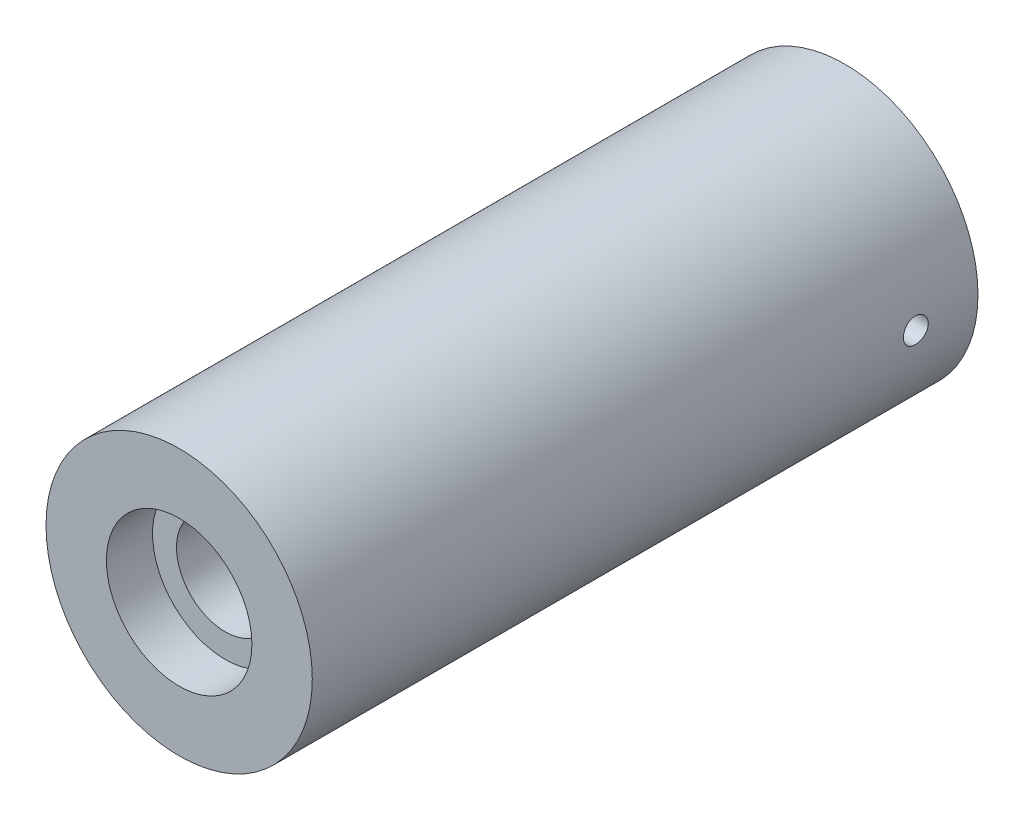
ISO-10303-21;
HEADER;
FILE_DESCRIPTION(('STEP AP214'),'2;1');
FILE_NAME('part.step','',(''),(''),'','','');
FILE_SCHEMA(('AUTOMOTIVE_DESIGN { 1 0 10303 214 1 1 1 1 }'));
ENDSEC;
DATA;
#1=APPLICATION_CONTEXT('core data for automotive mechanical design processes');
#2=APPLICATION_PROTOCOL_DEFINITION('international standard','automotive_design',2000,#1);
#3=PRODUCT_CONTEXT('',#1,'mechanical');
#4=PRODUCT('Part','Part','',(#3));
#5=PRODUCT_RELATED_PRODUCT_CATEGORY('part','',(#4));
#6=PRODUCT_DEFINITION_FORMATION('','',#4);
#7=PRODUCT_DEFINITION_CONTEXT('part definition',#1,'design');
#8=PRODUCT_DEFINITION('design','',#6,#7);
#9=PRODUCT_DEFINITION_SHAPE('','',#8);
#10=(LENGTH_UNIT() NAMED_UNIT(*) SI_UNIT(.MILLI.,.METRE.));
#11=(NAMED_UNIT(*) PLANE_ANGLE_UNIT() SI_UNIT($,.RADIAN.));
#12=(NAMED_UNIT(*) SI_UNIT($,.STERADIAN.) SOLID_ANGLE_UNIT());
#13=UNCERTAINTY_MEASURE_WITH_UNIT(LENGTH_MEASURE(1.E-05),#10,'distance_accuracy_value','');
#14=(GEOMETRIC_REPRESENTATION_CONTEXT(3) GLOBAL_UNCERTAINTY_ASSIGNED_CONTEXT((#13)) GLOBAL_UNIT_ASSIGNED_CONTEXT((#10,
#11,#12)) REPRESENTATION_CONTEXT('',''));
#15=CARTESIAN_POINT('',(0.,0.,0.));
#16=DIRECTION('',(0.,0.,1.));
#17=DIRECTION('',(1.,0.,0.));
#18=AXIS2_PLACEMENT_3D('',#15,#16,#17);
#19=CARTESIAN_POINT('',(2.25,1.08972473588517,25.));
#20=DIRECTION('',(1.,0.,0.));
#21=DIRECTION('',(0.,0.,-1.));
#22=AXIS2_PLACEMENT_3D('',#19,#20,#21);
#23=PLANE('',#22);
#24=DIRECTION('',(0.,1.,0.));
#25=VECTOR('',#24,1.);
#26=CARTESIAN_POINT('',(2.25,1.08972473588517,10.));
#27=LINE('',#26,#25);
#28=CARTESIAN_POINT('',(2.25,-1.08972473588517,10.));
#29=VERTEX_POINT('',#28);
#30=CARTESIAN_POINT('',(2.25,1.08972473588517,10.));
#31=VERTEX_POINT('',#30);
#32=EDGE_CURVE('E74',#29,#31,#27,.T.);
#33=ORIENTED_EDGE('',*,*,#32,.F.);
#34=DIRECTION('',(0.,0.,-1.));
#35=VECTOR('',#34,1.);
#36=CARTESIAN_POINT('',(2.25,-1.08972473588517,25.));
#37=LINE('',#36,#35);
#38=CARTESIAN_POINT('',(2.25,-1.08972473588517,25.));
#39=VERTEX_POINT('',#38);
#40=EDGE_CURVE('E54',#39,#29,#37,.T.);
#41=ORIENTED_EDGE('',*,*,#40,.F.);
#42=DIRECTION('',(0.,-1.,0.));
#43=VECTOR('',#42,1.);
#44=CARTESIAN_POINT('',(2.25,1.08972473588517,25.));
#45=LINE('',#44,#43);
#46=CARTESIAN_POINT('',(2.25,1.08972473588517,25.));
#47=VERTEX_POINT('',#46);
#48=EDGE_CURVE('E81',#47,#39,#45,.T.);
#49=ORIENTED_EDGE('',*,*,#48,.F.);
#50=DIRECTION('',(0.,0.,-1.));
#51=VECTOR('',#50,1.);
#52=CARTESIAN_POINT('',(2.25,1.08972473588517,25.));
#53=LINE('',#52,#51);
#54=EDGE_CURVE('E65',#47,#31,#53,.T.);
#55=ORIENTED_EDGE('',*,*,#54,.T.);
#56=EDGE_LOOP('',(#33,#41,#49,#55));
#57=FACE_BOUND('',#56,.T.);
#58=ADVANCED_FACE('F39',(#57),#23,.F.);
#59=CARTESIAN_POINT('',(0.,0.,0.));
#60=DIRECTION('',(0.,0.,1.));
#61=DIRECTION('',(1.,0.,0.));
#62=AXIS2_PLACEMENT_3D('',#59,#60,#61);
#63=PLANE('',#62);
#64=CARTESIAN_POINT('',(0.,0.,0.));
#65=DIRECTION('',(0.,0.,1.));
#66=DIRECTION('',(1.,0.,0.));
#67=AXIS2_PLACEMENT_3D('',#64,#65,#66);
#68=CIRCLE('',#67,15.);
#69=CARTESIAN_POINT('',(15.,0.,0.));
#70=VERTEX_POINT('',#69);
#71=EDGE_CURVE('E42',#70,#70,#68,.T.);
#72=ORIENTED_EDGE('',*,*,#71,.F.);
#73=EDGE_LOOP('',(#72));
#74=FACE_BOUND('',#73,.T.);
#75=CARTESIAN_POINT('',(0.,0.,0.));
#76=DIRECTION('',(0.,0.,-1.));
#77=DIRECTION('',(-1.,0.,0.));
#78=AXIS2_PLACEMENT_3D('',#75,#76,#77);
#79=CIRCLE('',#78,2.5);
#80=CARTESIAN_POINT('',(-2.5,0.,0.));
#81=VERTEX_POINT('',#80);
#82=EDGE_CURVE('E89',#81,#81,#79,.T.);
#83=ORIENTED_EDGE('',*,*,#82,.F.);
#84=EDGE_LOOP('',(#83));
#85=FACE_BOUND('',#84,.T.);
#86=ADVANCED_FACE('F97',(#74,#85),#63,.F.);
#87=CARTESIAN_POINT('',(0.,0.,75.));
#88=DIRECTION('',(0.,0.,-1.));
#89=DIRECTION('',(-1.,0.,0.));
#90=AXIS2_PLACEMENT_3D('',#87,#88,#89);
#91=CYLINDRICAL_SURFACE('',#90,15.);
#92=CARTESIAN_POINT('',(15.,0.,5.6));
#93=CARTESIAN_POINT('',(14.9999991517165,-0.0784554861699881,5.60000341027062));
#94=CARTESIAN_POINT('',(14.9993779241683,-0.156963492418424,5.60661712029103));
#95=CARTESIAN_POINT('',(14.9969594575657,-0.311804808033329,5.63290170743571));
#96=CARTESIAN_POINT('',(14.9951609074241,-0.388135593795627,5.65258714181733));
#97=CARTESIAN_POINT('',(14.9905909128656,-0.536357658042687,5.70443873188212));
#98=CARTESIAN_POINT('',(14.9878200405156,-0.60825151781433,5.73659755000731));
#99=CARTESIAN_POINT('',(14.9816156153183,-0.745604629702637,5.81246925392286));
#100=CARTESIAN_POINT('',(14.9781821984822,-0.811065198327592,5.85617976899219));
#101=CARTESIAN_POINT('',(14.9710254534397,-0.933916488889261,5.95406249153831));
#102=CARTESIAN_POINT('',(14.9673013394379,-0.991284072068567,6.008263685364));
#103=CARTESIAN_POINT('',(14.9599894683063,-1.09612219314731,6.12552756855102));
#104=CARTESIAN_POINT('',(14.9564017173533,-1.143592283162,6.18859065871783));
#105=CARTESIAN_POINT('',(14.9497606080928,-1.22736849148067,6.32193123636561));
#106=CARTESIAN_POINT('',(14.9467082454895,-1.26365390166605,6.39222178833874));
#107=CARTESIAN_POINT('',(14.9414929816294,-1.32389849677488,6.53793122010739));
#108=CARTESIAN_POINT('',(14.9393300610498,-1.34785794947726,6.61334998845314));
#109=CARTESIAN_POINT('',(14.936145496082,-1.38270247263863,6.76694053549127));
#110=CARTESIAN_POINT('',(14.9351205242785,-1.39362566877907,6.84510359461255));
#111=CARTESIAN_POINT('',(14.9343175096359,-1.40220543303307,7.00215986702185));
#112=CARTESIAN_POINT('',(14.9345394379811,-1.39986230772999,7.0810530633944));
#113=CARTESIAN_POINT('',(14.936202115248,-1.38200740057497,7.23706796046477));
#114=CARTESIAN_POINT('',(14.9376390188335,-1.36653716483014,7.31419446257597));
#115=CARTESIAN_POINT('',(14.9415637279929,-1.3229317833289,7.4647514770717));
#116=CARTESIAN_POINT('',(14.9440515461114,-1.29479648639373,7.53818194532623));
#117=CARTESIAN_POINT('',(14.9498021974978,-1.22661350410638,7.67939420224959));
#118=CARTESIAN_POINT('',(14.9530662340639,-1.18654729883092,7.74716699775896));
#119=CARTESIAN_POINT('',(14.9600004940727,-1.09565315755664,7.8750417054853));
#120=CARTESIAN_POINT('',(14.9636707278602,-1.04482494744639,7.93514342225514));
#121=CARTESIAN_POINT('',(14.9710209657405,-0.933617166390655,8.04621138978885));
#122=CARTESIAN_POINT('',(14.9747009532956,-0.873201699642548,8.09714170757638));
#123=CARTESIAN_POINT('',(14.9816427135684,-0.744659269520931,8.18814293212557));
#124=CARTESIAN_POINT('',(14.9849044859039,-0.676532299100624,8.22821382896373));
#125=CARTESIAN_POINT('',(14.9906431773787,-0.534476488924546,8.29635696928917));
#126=CARTESIAN_POINT('',(14.9931199836404,-0.46054681664963,8.32442748733264));
#127=CARTESIAN_POINT('',(14.9970084692196,-0.308995503147893,8.36774721317623));
#128=CARTESIAN_POINT('',(14.9984201762744,-0.231373958121248,8.38299675486298));
#129=CARTESIAN_POINT('',(15.0000158417889,-0.0749535881952363,8.40019628923636));
#130=CARTESIAN_POINT('',(15.0002043794813,0.00383973753803389,8.40219588692052));
#131=CARTESIAN_POINT('',(14.9993447216857,0.160640433579482,8.39296891561115));
#132=CARTESIAN_POINT('',(14.9982965407188,0.238647813105209,8.38174250191435));
#133=CARTESIAN_POINT('',(14.9950842081504,0.391519830572331,8.34642332144968));
#134=CARTESIAN_POINT('',(14.9929220627913,0.466389857621273,8.32235368247737));
#135=CARTESIAN_POINT('',(14.9877244991512,0.611029155301125,8.26205500629568));
#136=CARTESIAN_POINT('',(14.9846890637001,0.680798325609114,8.22582573001061));
#137=CARTESIAN_POINT('',(14.9780733491988,0.81348031772675,8.14211248475457));
#138=CARTESIAN_POINT('',(14.9744914978868,0.876372424882499,8.09459581014424));
#139=CARTESIAN_POINT('',(14.9671902213441,0.993305576308237,7.98970363376357));
#140=CARTESIAN_POINT('',(14.9634707931127,1.04734642737625,7.93232791684965));
#141=CARTESIAN_POINT('',(14.9562998789109,1.1452144045754,7.8091303964511));
#142=CARTESIAN_POINT('',(14.9528492674784,1.18900905261651,7.74328273437906));
#143=CARTESIAN_POINT('',(14.9466196226998,1.26491843045986,7.60513853058526));
#144=CARTESIAN_POINT('',(14.9438405812031,1.29703330201919,7.53284206714569));
#145=CARTESIAN_POINT('',(14.9392739803509,1.34861672923249,7.38396539766082));
#146=CARTESIAN_POINT('',(14.9374848881862,1.36810484384011,7.3073920174401));
#147=CARTESIAN_POINT('',(14.9350958511036,1.39394511693481,7.15204243294452));
#148=CARTESIAN_POINT('',(14.9344958768556,1.40029759941798,7.07326628305051));
#149=CARTESIAN_POINT('',(14.93455354936,1.39968211070601,6.91607010715249));
#150=CARTESIAN_POINT('',(14.9352063789337,1.39276516207406,6.83764987459151));
#151=CARTESIAN_POINT('',(14.937685846208,1.36591389035994,6.68309039868159));
#152=CARTESIAN_POINT('',(14.939512485443,1.34597955026162,6.60695115831447));
#153=CARTESIAN_POINT('',(14.9441324495578,1.2936729647091,6.45911383312109));
#154=CARTESIAN_POINT('',(14.9469256764569,1.26130197989182,6.38741529901901));
#155=CARTESIAN_POINT('',(14.9531642823478,1.18504641417917,6.25046152930228));
#156=CARTESIAN_POINT('',(14.9566096549239,1.14116194654949,6.18520623030999));
#157=CARTESIAN_POINT('',(14.963780179175,1.04293332569438,6.06272986483989));
#158=CARTESIAN_POINT('',(14.9675063150937,0.988551222727769,6.00553929206753));
#159=CARTESIAN_POINT('',(14.9748095144459,0.870944074560282,5.90107177147141));
#160=CARTESIAN_POINT('',(14.9783865418079,0.807716905530001,5.85379721146117));
#161=CARTESIAN_POINT('',(14.9849966022118,0.674062623514548,5.77042302833517));
#162=CARTESIAN_POINT('',(14.9880284001076,0.603619716569505,5.73434864684714));
#163=CARTESIAN_POINT('',(14.9931925943904,0.457694436027753,5.67458742250823));
#164=CARTESIAN_POINT('',(14.9953260126733,0.382217901991779,5.65088649759649));
#165=CARTESIAN_POINT('',(14.997912095027,0.255255312002654,5.62250823961042));
#166=CARTESIAN_POINT('',(14.9986914450111,0.204583006259677,5.6140790493376));
#167=CARTESIAN_POINT('',(14.9997356740379,0.102614622650236,5.60282382393607));
#168=CARTESIAN_POINT('',(15.000000554871,0.0513185469553201,5.59999776930662));
#169=CARTESIAN_POINT('',(15.,0.,5.6));
#170=B_SPLINE_CURVE_WITH_KNOTS('',3,(#92,#93,#94,#95,#96,#97,#98,#99,#100,#101,#102,#103,#104,
#105,#106,#107,#108,#109,#110,#111,#112,#113,#114,#115,#116,#117,#118,#119,#120,#121,#122,#123,
#124,#125,#126,#127,#128,#129,#130,#131,#132,#133,#134,#135,#136,#137,#138,#139,#140,#141,#142,
#143,#144,#145,#146,#147,#148,#149,#150,#151,#152,#153,#154,#155,#156,#157,#158,#159,#160,#161,
#162,#163,#164,#165,#166,#167,#168,#169),.UNSPECIFIED.,.T.,.F.,(4,2,2,2,2,2,2,2,2,2,2,2,2,2,2,2,
2,2,2,2,2,2,2,2,2,2,2,2,2,2,2,2,2,2,2,2,2,2,4),(0.,0.235179074021336,0.470620494215495,
0.705923623838595,0.941178500337391,1.17709292636142,1.41301802574975,1.64937734583626,
1.88573153084733,2.12139276991977,2.35704856290674,2.59196129673,2.82687683470533,
3.0621589415926,3.29744704190522,3.5336378284454,3.76982883081917,4.00605378190007,
4.24227258096908,4.47760652454637,4.71293770491523,4.94784652926722,5.18275997253012,
5.41836257196166,5.65397031335536,5.89031505367139,6.12665692538264,6.36263182070682,
6.59860089553819,6.83366445911064,7.06872832995534,7.30376837990214,7.53880611769231,
7.77471000935563,8.01067064252098,8.24715925896353,8.48337814098885,8.63721174711015,
8.79104481783924),.UNSPECIFIED.);
#171=CARTESIAN_POINT('',(15.,0.,5.6));
#172=VERTEX_POINT('',#171);
#173=EDGE_CURVE('E101',#172,#172,#170,.T.);
#174=ORIENTED_EDGE('',*,*,#173,.T.);
#175=EDGE_LOOP('',(#174));
#176=FACE_BOUND('',#175,.T.);
#177=CARTESIAN_POINT('',(0.,0.,75.));
#178=DIRECTION('',(0.,0.,1.));
#179=DIRECTION('',(1.,0.,0.));
#180=AXIS2_PLACEMENT_3D('',#177,#178,#179);
#181=CIRCLE('',#180,15.);
#182=CARTESIAN_POINT('',(15.,0.,75.));
#183=VERTEX_POINT('',#182);
#184=EDGE_CURVE('E11',#183,#183,#181,.T.);
#185=ORIENTED_EDGE('',*,*,#184,.F.);
#186=EDGE_LOOP('',(#185));
#187=FACE_BOUND('',#186,.T.);
#188=ORIENTED_EDGE('',*,*,#71,.T.);
#189=EDGE_LOOP('',(#188));
#190=FACE_BOUND('',#189,.T.);
#191=ADVANCED_FACE('F41',(#176,#187,#190),#91,.T.);
#192=CARTESIAN_POINT('',(0.,0.,75.));
#193=DIRECTION('',(0.,0.,1.));
#194=DIRECTION('',(1.,0.,0.));
#195=AXIS2_PLACEMENT_3D('',#192,#193,#194);
#196=PLANE('',#195);
#197=CARTESIAN_POINT('',(0.,0.,75.));
#198=DIRECTION('',(0.,0.,1.));
#199=DIRECTION('',(1.,0.,0.));
#200=AXIS2_PLACEMENT_3D('',#197,#198,#199);
#201=CIRCLE('',#200,8.2);
#202=CARTESIAN_POINT('',(8.2,0.,75.));
#203=VERTEX_POINT('',#202);
#204=EDGE_CURVE('E79',#203,#203,#201,.T.);
#205=ORIENTED_EDGE('',*,*,#204,.F.);
#206=EDGE_LOOP('',(#205));
#207=FACE_BOUND('',#206,.T.);
#208=ORIENTED_EDGE('',*,*,#184,.T.);
#209=EDGE_LOOP('',(#208));
#210=FACE_BOUND('',#209,.T.);
#211=ADVANCED_FACE('F150',(#207,#210),#196,.T.);
#212=CARTESIAN_POINT('',(0.,0.,69.8));
#213=DIRECTION('',(0.,0.,1.));
#214=DIRECTION('',(1.,0.,0.));
#215=AXIS2_PLACEMENT_3D('',#212,#213,#214);
#216=CYLINDRICAL_SURFACE('',#215,8.2);
#217=CARTESIAN_POINT('',(0.,0.,69.8));
#218=DIRECTION('',(0.,0.,1.));
#219=DIRECTION('',(1.,0.,0.));
#220=AXIS2_PLACEMENT_3D('',#217,#218,#219);
#221=CIRCLE('',#220,8.2);
#222=CARTESIAN_POINT('',(8.2,0.,69.8));
#223=VERTEX_POINT('',#222);
#224=EDGE_CURVE('E85',#223,#223,#221,.T.);
#225=ORIENTED_EDGE('',*,*,#224,.F.);
#226=EDGE_LOOP('',(#225));
#227=FACE_BOUND('',#226,.T.);
#228=ORIENTED_EDGE('',*,*,#204,.T.);
#229=EDGE_LOOP('',(#228));
#230=FACE_BOUND('',#229,.T.);
#231=ADVANCED_FACE('F141',(#227,#230),#216,.F.);
#232=CARTESIAN_POINT('',(0.,0.,69.8));
#233=DIRECTION('',(0.,0.,1.));
#234=DIRECTION('',(1.,0.,0.));
#235=AXIS2_PLACEMENT_3D('',#232,#233,#234);
#236=PLANE('',#235);
#237=CARTESIAN_POINT('',(0.,0.,69.8));
#238=DIRECTION('',(0.,0.,1.));
#239=DIRECTION('',(1.,0.,0.));
#240=AXIS2_PLACEMENT_3D('',#237,#238,#239);
#241=CIRCLE('',#240,5.5);
#242=CARTESIAN_POINT('',(5.5,0.,69.8));
#243=VERTEX_POINT('',#242);
#244=EDGE_CURVE('E75',#243,#243,#241,.T.);
#245=ORIENTED_EDGE('',*,*,#244,.F.);
#246=EDGE_LOOP('',(#245));
#247=FACE_BOUND('',#246,.T.);
#248=ORIENTED_EDGE('',*,*,#224,.T.);
#249=EDGE_LOOP('',(#248));
#250=FACE_BOUND('',#249,.T.);
#251=ADVANCED_FACE('F140',(#247,#250),#236,.T.);
#252=CARTESIAN_POINT('',(0.,0.,25.));
#253=DIRECTION('',(0.,0.,-1.));
#254=DIRECTION('',(-1.,0.,0.));
#255=AXIS2_PLACEMENT_3D('',#252,#253,#254);
#256=CYLINDRICAL_SURFACE('',#255,2.5);
#257=CARTESIAN_POINT('',(2.25,-1.08972473588517,7.87891979156235));
#258=CARTESIAN_POINT('',(2.2274568608921,-1.13626840507539,7.82121213723242));
#259=CARTESIAN_POINT('',(2.20529105901085,-1.1783405112215,7.7596708011014));
#260=CARTESIAN_POINT('',(2.16399645530751,-1.25257014866127,7.62981592874616));
#261=CARTESIAN_POINT('',(2.14487146385837,-1.28471528745847,7.56149406733274));
#262=CARTESIAN_POINT('',(2.11201070024074,-1.33806079779131,7.41883534188775));
#263=CARTESIAN_POINT('',(2.09831297060651,-1.35918422802114,7.34446027525867));
#264=CARTESIAN_POINT('',(2.07878230458862,-1.38888327426292,7.19231256622887));
#265=CARTESIAN_POINT('',(2.07293449237111,-1.397482626422,7.11454663932029));
#266=CARTESIAN_POINT('',(2.07033224666448,-1.40132835109835,6.96752383227563));
#267=CARTESIAN_POINT('',(2.0726090217933,-1.39799716260012,6.89831733851376));
#268=CARTESIAN_POINT('',(2.08378672169807,-1.38127871764231,6.76164503812222));
#269=CARTESIAN_POINT('',(2.09269288793017,-1.36788350409214,6.69418065256549));
#270=CARTESIAN_POINT('',(2.11548561734288,-1.33234513623002,6.56502930483004));
#271=CARTESIAN_POINT('',(2.12919618182848,-1.31050861869742,6.50322470171844));
#272=CARTESIAN_POINT('',(2.16010657078403,-1.25890413628633,6.38406774606649));
#273=CARTESIAN_POINT('',(2.1773028024552,-1.22914432839788,6.32671089256299));
#274=CARTESIAN_POINT('',(2.21295688113878,-1.16368286604503,6.21919701793294));
#275=CARTESIAN_POINT('',(2.23134101873202,-1.12825296322586,6.16884820064442));
#276=CARTESIAN_POINT('',(2.27399555929171,-1.04017720966813,6.05965029043827));
#277=CARTESIAN_POINT('',(2.29844565809726,-0.985505640036039,6.0024885695479));
#278=CARTESIAN_POINT('',(2.34578757344311,-0.866816607374944,5.89777279962129));
#279=CARTESIAN_POINT('',(2.36867604610843,-0.802779958629396,5.85023896326456));
#280=CARTESIAN_POINT('',(2.41062971986975,-0.666313784425671,5.76611600804346));
#281=CARTESIAN_POINT('',(2.42967948440057,-0.593852150509292,5.729570798919));
#282=CARTESIAN_POINT('',(2.46172264331037,-0.442576952438201,5.66931121751967));
#283=CARTESIAN_POINT('',(2.47472467728572,-0.363772639329211,5.64557853383558));
#284=CARTESIAN_POINT('',(2.49230788677459,-0.209497070772028,5.61372549709588));
#285=CARTESIAN_POINT('',(2.49753139346423,-0.134346185175959,5.60441134634638));
#286=CARTESIAN_POINT('',(2.50108260258652,0.0166256406623452,5.59806441256835));
#287=CARTESIAN_POINT('',(2.49941318242188,0.0924462881303429,5.60102650491241));
#288=CARTESIAN_POINT('',(2.48980756813687,0.235753015054922,5.61826766738754));
#289=CARTESIAN_POINT('',(2.48241749144378,0.303398765662233,5.63156090293251));
#290=CARTESIAN_POINT('',(2.46270523453056,0.435357775334948,5.66765425288771));
#291=CARTESIAN_POINT('',(2.45038101841527,0.499669646407617,5.69045829175113));
#292=CARTESIAN_POINT('',(2.42122643317067,0.626140373468664,5.74584124786018));
#293=CARTESIAN_POINT('',(2.40423022973285,0.688099001328697,5.77878667126776));
#294=CARTESIAN_POINT('',(2.36738708189011,0.805777912080863,5.8530216622909));
#295=CARTESIAN_POINT('',(2.34754221345186,0.861502685731815,5.89430516236742));
#296=CARTESIAN_POINT('',(2.31445160423974,0.945782054206797,5.96690357538685));
#297=CARTESIAN_POINT('',(2.30161580253164,0.976520849377112,5.99591429126594));
#298=CARTESIAN_POINT('',(2.27581250698591,1.03523213530853,6.0565616578663));
#299=CARTESIAN_POINT('',(2.26284499884969,1.06320432209776,6.08819859643419));
#300=CARTESIAN_POINT('',(2.2274568608921,1.13626840507539,6.17878786276758));
#301=CARTESIAN_POINT('',(2.20529105901085,1.1783405112215,6.2403291988986));
#302=CARTESIAN_POINT('',(2.16399645530751,1.25257014866128,6.37018407125384));
#303=CARTESIAN_POINT('',(2.14487146385837,1.28471528745847,6.43850593266726));
#304=CARTESIAN_POINT('',(2.11201070024074,1.33806079779131,6.58116465811225));
#305=CARTESIAN_POINT('',(2.09831297060651,1.35918422802114,6.65553972474133));
#306=CARTESIAN_POINT('',(2.07878230458862,1.38888327426292,6.80768743377113));
#307=CARTESIAN_POINT('',(2.07293449237111,1.397482626422,6.88545336067971));
#308=CARTESIAN_POINT('',(2.07033224666448,1.40132835109835,7.03247616772437));
#309=CARTESIAN_POINT('',(2.0726090217933,1.39799716260012,7.10168266148624));
#310=CARTESIAN_POINT('',(2.08378672169807,1.38127871764231,7.23835496187778));
#311=CARTESIAN_POINT('',(2.09269288793017,1.36788350409213,7.30581934743451));
#312=CARTESIAN_POINT('',(2.11548561734288,1.33234513623002,7.43497069516996));
#313=CARTESIAN_POINT('',(2.12919618182848,1.31050861869742,7.49677529828156));
#314=CARTESIAN_POINT('',(2.16010657078403,1.25890413628633,7.61593225393351));
#315=CARTESIAN_POINT('',(2.1773028024552,1.22914432839788,7.67328910743701));
#316=CARTESIAN_POINT('',(2.21295688113878,1.16368286604503,7.78080298206706));
#317=CARTESIAN_POINT('',(2.23134101873202,1.12825296322586,7.83115179935558));
#318=CARTESIAN_POINT('',(2.27399555929171,1.04017720966814,7.94034970956172));
#319=CARTESIAN_POINT('',(2.29844565809726,0.98550564003604,7.99751143045209));
#320=CARTESIAN_POINT('',(2.34578757344311,0.866816607374945,8.10222720037871));
#321=CARTESIAN_POINT('',(2.36867604610842,0.802779958629397,8.14976103673544));
#322=CARTESIAN_POINT('',(2.41062971986975,0.666313784425673,8.23388399195653));
#323=CARTESIAN_POINT('',(2.42967948440057,0.593852150509294,8.270429201081));
#324=CARTESIAN_POINT('',(2.46172264331037,0.442576952438202,8.33068878248033));
#325=CARTESIAN_POINT('',(2.47472467728572,0.363772639329213,8.35442146616442));
#326=CARTESIAN_POINT('',(2.49230788677459,0.209497070772031,8.38627450290412));
#327=CARTESIAN_POINT('',(2.49753139346423,0.134346185175962,8.39558865365361));
#328=CARTESIAN_POINT('',(2.50108260258652,-0.0166256406623423,8.40193558743164));
#329=CARTESIAN_POINT('',(2.49941318242188,-0.0924462881303403,8.39897349508759));
#330=CARTESIAN_POINT('',(2.48980756813687,-0.235753015054919,8.38173233261246));
#331=CARTESIAN_POINT('',(2.48241749144378,-0.30339876566223,8.36843909706749));
#332=CARTESIAN_POINT('',(2.46270523453057,-0.435357775334946,8.33234574711229));
#333=CARTESIAN_POINT('',(2.45038101841527,-0.499669646407615,8.30954170824887));
#334=CARTESIAN_POINT('',(2.42122643317067,-0.626140373468662,8.25415875213982));
#335=CARTESIAN_POINT('',(2.40423022973285,-0.688099001328695,8.22121332873223));
#336=CARTESIAN_POINT('',(2.36738708189011,-0.805777912080861,8.14697833770909));
#337=CARTESIAN_POINT('',(2.34754221345186,-0.861502685731813,8.10569483763257));
#338=CARTESIAN_POINT('',(2.31445160423974,-0.945782054206795,8.03309642461315));
#339=CARTESIAN_POINT('',(2.30161580253164,-0.976520849377109,8.00408570873406));
#340=CARTESIAN_POINT('',(2.27581250698591,-1.03523213530853,7.9434383421337));
#341=CARTESIAN_POINT('',(2.26284499884969,-1.06320432209776,7.91180140356581));
#342=CARTESIAN_POINT('',(2.25,-1.08972473588517,7.87891979156235));
#343=B_SPLINE_CURVE_WITH_KNOTS('',3,(#257,#258,#259,#260,#261,#262,#263,#264,#265,#266,#267,
#268,#269,#270,#271,#272,#273,#274,#275,#276,#277,#278,#279,#280,#281,#282,#283,#284,#285,#286,
#287,#288,#289,#290,#291,#292,#293,#294,#295,#296,#297,#298,#299,#300,#301,#302,#303,#304,#305,
#306,#307,#308,#309,#310,#311,#312,#313,#314,#315,#316,#317,#318,#319,#320,#321,#322,#323,#324,
#325,#326,#327,#328,#329,#330,#331,#332,#333,#334,#335,#336,#337,#338,#339,#340,#341,#342),
.UNSPECIFIED.,.T.,.F.,(4,2,2,2,2,2,2,2,2,2,2,2,2,2,2,2,2,2,2,2,2,2,2,2,2,2,2,2,2,2,2,2,2,2,2,2,
2,2,2,2,2,2,4),(0.,0.232332186359433,0.464953246879306,0.699177186253874,0.932956634515792,
1.13983967456769,1.34688645842286,1.5470283502115,1.74696498829966,1.9392312994454,
2.18648690266608,2.43425633086413,2.6830030575322,2.9313933327756,3.15784487387642,
3.38420189397002,3.59127088084164,3.79842539548308,4.01418005433296,4.22977827260727,
4.36214578189024,4.49452781849339,4.72686000485283,4.9594810653727,5.19370500474727,
5.42748445300919,5.63436749306109,5.84141427691625,6.0415561687049,6.24149280679305,
6.43375911793879,6.68101472115947,6.92878414935752,7.17753087602559,7.42592115126898,
7.6523726923698,7.87872971246341,8.08579869933503,8.29295321397647,8.50870787282635,
8.72430609110066,8.85667360038363,8.98905563698678),.UNSPECIFIED.);
#344=CARTESIAN_POINT('',(2.25,-1.08972473588517,7.87891979156235));
#345=VERTEX_POINT('',#344);
#346=EDGE_CURVE('E106',#345,#345,#343,.T.);
#347=ORIENTED_EDGE('',*,*,#346,.T.);
#348=EDGE_LOOP('',(#347));
#349=FACE_BOUND('',#348,.T.);
#350=ORIENTED_EDGE('',*,*,#82,.T.);
#351=EDGE_LOOP('',(#350));
#352=FACE_BOUND('',#351,.T.);
#353=CARTESIAN_POINT('',(0.,0.,10.));
#354=DIRECTION('',(0.,0.,-1.));
#355=DIRECTION('',(-1.,0.,0.));
#356=AXIS2_PLACEMENT_3D('',#353,#354,#355);
#357=CIRCLE('',#356,2.5);
#358=EDGE_CURVE('E68',#31,#29,#357,.T.);
#359=ORIENTED_EDGE('',*,*,#358,.F.);
#360=ORIENTED_EDGE('',*,*,#54,.F.);
#361=CARTESIAN_POINT('',(0.,0.,25.));
#362=DIRECTION('',(0.,0.,-1.));
#363=DIRECTION('',(-1.,0.,0.));
#364=AXIS2_PLACEMENT_3D('',#361,#362,#363);
#365=CIRCLE('',#364,2.5);
#366=EDGE_CURVE('E80',#39,#47,#365,.T.);
#367=ORIENTED_EDGE('',*,*,#366,.F.);
#368=ORIENTED_EDGE('',*,*,#40,.T.);
#369=EDGE_LOOP('',(#359,#360,#367,#368));
#370=FACE_BOUND('',#369,.T.);
#371=ADVANCED_FACE('F77',(#349,#352,#370),#256,.F.);
#372=CARTESIAN_POINT('',(0.,0.,25.));
#373=DIRECTION('',(0.,0.,-1.));
#374=DIRECTION('',(-1.,0.,0.));
#375=AXIS2_PLACEMENT_3D('',#372,#373,#374);
#376=PLANE('',#375);
#377=ORIENTED_EDGE('',*,*,#366,.T.);
#378=ORIENTED_EDGE('',*,*,#48,.T.);
#379=EDGE_LOOP('',(#377,#378));
#380=FACE_BOUND('',#379,.T.);
#381=ADVANCED_FACE('F129',(#380),#376,.T.);
#382=CARTESIAN_POINT('',(1.,0.,7.));
#383=DIRECTION('',(1.,0.,0.));
#384=DIRECTION('',(0.,0.,-1.));
#385=AXIS2_PLACEMENT_3D('',#382,#383,#384);
#386=CYLINDRICAL_SURFACE('',#385,1.4);
#387=ORIENTED_EDGE('',*,*,#346,.F.);
#388=EDGE_LOOP('',(#387));
#389=FACE_BOUND('',#388,.T.);
#390=ORIENTED_EDGE('',*,*,#173,.F.);
#391=EDGE_LOOP('',(#390));
#392=FACE_BOUND('',#391,.T.);
#393=ADVANCED_FACE('F125',(#389,#392),#386,.F.);
#394=CARTESIAN_POINT('',(0.,0.,44.8));
#395=DIRECTION('',(0.,0.,1.));
#396=DIRECTION('',(1.,0.,0.));
#397=AXIS2_PLACEMENT_3D('',#394,#395,#396);
#398=CYLINDRICAL_SURFACE('',#397,5.5);
#399=CARTESIAN_POINT('',(0.,0.,44.8));
#400=DIRECTION('',(0.,0.,1.));
#401=DIRECTION('',(1.,0.,0.));
#402=AXIS2_PLACEMENT_3D('',#399,#400,#401);
#403=CIRCLE('',#402,5.5);
#404=CARTESIAN_POINT('',(5.5,0.,44.8));
#405=VERTEX_POINT('',#404);
#406=EDGE_CURVE('E111',#405,#405,#403,.T.);
#407=ORIENTED_EDGE('',*,*,#406,.F.);
#408=EDGE_LOOP('',(#407));
#409=FACE_BOUND('',#408,.T.);
#410=ORIENTED_EDGE('',*,*,#244,.T.);
#411=EDGE_LOOP('',(#410));
#412=FACE_BOUND('',#411,.T.);
#413=ADVANCED_FACE('F130',(#409,#412),#398,.F.);
#414=CARTESIAN_POINT('',(0.,0.,44.8));
#415=DIRECTION('',(0.,0.,1.));
#416=DIRECTION('',(1.,0.,0.));
#417=AXIS2_PLACEMENT_3D('',#414,#415,#416);
#418=PLANE('',#417);
#419=ORIENTED_EDGE('',*,*,#406,.T.);
#420=EDGE_LOOP('',(#419));
#421=FACE_BOUND('',#420,.T.);
#422=ADVANCED_FACE('F180',(#421),#418,.T.);
#423=CARTESIAN_POINT('',(0.,0.,10.));
#424=DIRECTION('',(0.,0.,-1.));
#425=DIRECTION('',(-1.,0.,0.));
#426=AXIS2_PLACEMENT_3D('',#423,#424,#425);
#427=PLANE('',#426);
#428=ORIENTED_EDGE('',*,*,#358,.T.);
#429=ORIENTED_EDGE('',*,*,#32,.T.);
#430=EDGE_LOOP('',(#428,#429));
#431=FACE_BOUND('',#430,.T.);
#432=ADVANCED_FACE('F73',(#431),#427,.T.);
#433=CLOSED_SHELL('',(#58,#86,#191,#211,#231,#251,#371,#381,#393,#413,#422,#432));
#434=MANIFOLD_SOLID_BREP('B2',#433);
#435=ADVANCED_BREP_SHAPE_REPRESENTATION('',(#18,#434),#14);
#436=SHAPE_DEFINITION_REPRESENTATION(#9,#435);
ENDSEC;
END-ISO-10303-21;
